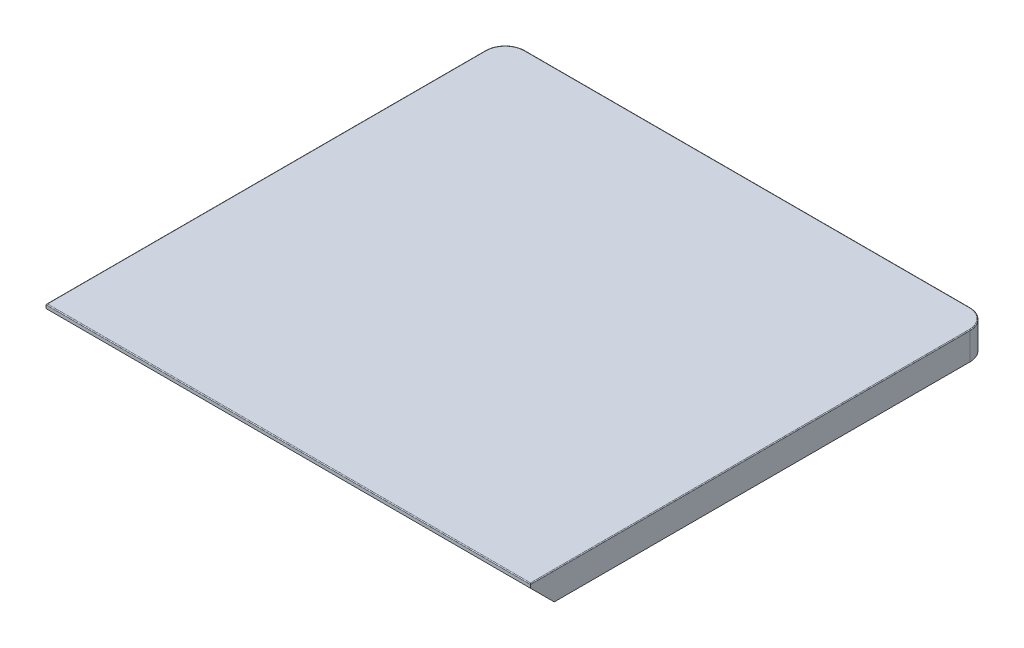
ISO-10303-21;
HEADER;
FILE_DESCRIPTION(('STEP AP214'),'2;1');
FILE_NAME('part.step','',(''),(''),'','','');
FILE_SCHEMA(('AUTOMOTIVE_DESIGN { 1 0 10303 214 1 1 1 1 }'));
ENDSEC;
DATA;
#1=APPLICATION_CONTEXT('core data for automotive mechanical design processes');
#2=APPLICATION_PROTOCOL_DEFINITION('international standard','automotive_design',2000,#1);
#3=PRODUCT_CONTEXT('',#1,'mechanical');
#4=PRODUCT('Part','Part','',(#3));
#5=PRODUCT_RELATED_PRODUCT_CATEGORY('part','',(#4));
#6=PRODUCT_DEFINITION_FORMATION('','',#4);
#7=PRODUCT_DEFINITION_CONTEXT('part definition',#1,'design');
#8=PRODUCT_DEFINITION('design','',#6,#7);
#9=PRODUCT_DEFINITION_SHAPE('','',#8);
#10=(LENGTH_UNIT() NAMED_UNIT(*) SI_UNIT(.MILLI.,.METRE.));
#11=(NAMED_UNIT(*) PLANE_ANGLE_UNIT() SI_UNIT($,.RADIAN.));
#12=(NAMED_UNIT(*) SI_UNIT($,.STERADIAN.) SOLID_ANGLE_UNIT());
#13=UNCERTAINTY_MEASURE_WITH_UNIT(LENGTH_MEASURE(1.E-05),#10,'distance_accuracy_value','');
#14=(GEOMETRIC_REPRESENTATION_CONTEXT(3) GLOBAL_UNCERTAINTY_ASSIGNED_CONTEXT((#13)) GLOBAL_UNIT_ASSIGNED_CONTEXT((#10,
#11,#12)) REPRESENTATION_CONTEXT('',''));
#15=CARTESIAN_POINT('',(0.,0.,0.));
#16=DIRECTION('',(0.,0.,1.));
#17=DIRECTION('',(1.,0.,0.));
#18=AXIS2_PLACEMENT_3D('',#15,#16,#17);
#19=CARTESIAN_POINT('',(0.,-35.,0.));
#20=DIRECTION('',(0.,-1.,0.));
#21=DIRECTION('',(0.,0.,-1.));
#22=AXIS2_PLACEMENT_3D('',#19,#20,#21);
#23=PLANE('',#22);
#24=DIRECTION('',(0.,0.,1.));
#25=VECTOR('',#24,1.);
#26=CARTESIAN_POINT('',(5.42321072285179,-35.,179.503525588153));
#27=LINE('',#26,#25);
#28=CARTESIAN_POINT('',(5.42321072285179,-35.,-175.496474411846));
#29=VERTEX_POINT('',#28);
#30=CARTESIAN_POINT('',(5.42321072285179,-35.,179.503525588153));
#31=VERTEX_POINT('',#30);
#32=EDGE_CURVE('E66',#29,#31,#27,.T.);
#33=ORIENTED_EDGE('',*,*,#32,.F.);
#34=DIRECTION('',(1.,0.,0.));
#35=VECTOR('',#34,1.);
#36=CARTESIAN_POINT('',(19.7759190350162,-35.,-175.496474411846));
#37=LINE('',#36,#35);
#38=CARTESIAN_POINT('',(19.7759190350162,-35.,-175.496474411846));
#39=VERTEX_POINT('',#38);
#40=EDGE_CURVE('E395',#29,#39,#37,.T.);
#41=ORIENTED_EDGE('',*,*,#40,.T.);
#42=DIRECTION('',(0.,0.,1.));
#43=VECTOR('',#42,1.);
#44=CARTESIAN_POINT('',(19.7759190350162,-35.,-225.496474411847));
#45=LINE('',#44,#43);
#46=CARTESIAN_POINT('',(19.7759190350162,-35.,179.503525588153));
#47=VERTEX_POINT('',#46);
#48=EDGE_CURVE('E301',#39,#47,#45,.T.);
#49=ORIENTED_EDGE('',*,*,#48,.T.);
#50=DIRECTION('',(-1.,0.,0.));
#51=VECTOR('',#50,1.);
#52=CARTESIAN_POINT('',(-18.1501687280572,-35.,179.503525588153));
#53=LINE('',#52,#51);
#54=EDGE_CURVE('E392',#47,#31,#53,.T.);
#55=ORIENTED_EDGE('',*,*,#54,.T.);
#56=EDGE_LOOP('',(#33,#41,#49,#55));
#57=FACE_BOUND('',#56,.T.);
#58=ADVANCED_FACE('F42',(#57),#23,.T.);
#59=CARTESIAN_POINT('',(0.,-35.,0.));
#60=DIRECTION('',(0.,-1.,0.));
#61=DIRECTION('',(0.,0.,-1.));
#62=AXIS2_PLACEMENT_3D('',#59,#60,#61);
#63=PLANE('',#62);
#64=DIRECTION('',(0.,0.,1.));
#65=VECTOR('',#64,1.);
#66=CARTESIAN_POINT('',(-375.815236259086,-35.,179.39659219798));
#67=LINE('',#66,#65);
#68=CARTESIAN_POINT('',(-375.815236259086,-35.,-175.09436473107));
#69=VERTEX_POINT('',#68);
#70=CARTESIAN_POINT('',(-375.815236259086,-35.,179.39659219798));
#71=VERTEX_POINT('',#70);
#72=EDGE_CURVE('E58',#69,#71,#67,.T.);
#73=ORIENTED_EDGE('',*,*,#72,.F.);
#74=DIRECTION('',(0.999821655017895,0.,0.0188853953434227));
#75=VECTOR('',#74,1.);
#76=CARTESIAN_POINT('',(-363.236846186385,-35.,-174.856774488736));
#77=LINE('',#76,#75);
#78=CARTESIAN_POINT('',(-362.292576419214,-35.,-174.838938399895));
#79=VERTEX_POINT('',#78);
#80=EDGE_CURVE('E411',#69,#79,#77,.T.);
#81=ORIENTED_EDGE('',*,*,#80,.T.);
#82=DIRECTION('',(0.,0.,1.));
#83=VECTOR('',#82,1.);
#84=CARTESIAN_POINT('',(-362.292576419214,-35.,-224.847857239631));
#85=LINE('',#84,#83);
#86=CARTESIAN_POINT('',(-362.292576419214,-35.,179.39659219798));
#87=VERTEX_POINT('',#86);
#88=EDGE_CURVE('E253',#79,#87,#85,.T.);
#89=ORIENTED_EDGE('',*,*,#88,.T.);
#90=DIRECTION('',(-1.,0.,0.));
#91=VECTOR('',#90,1.);
#92=CARTESIAN_POINT('',(-402.292576419214,-35.,179.39659219798));
#93=LINE('',#92,#91);
#94=EDGE_CURVE('E408',#87,#71,#93,.T.);
#95=ORIENTED_EDGE('',*,*,#94,.T.);
#96=EDGE_LOOP('',(#73,#81,#89,#95));
#97=FACE_BOUND('',#96,.T.);
#98=ADVANCED_FACE('F444',(#97),#63,.T.);
#99=CARTESIAN_POINT('',(0.,0.,0.));
#100=DIRECTION('',(0.,1.,0.));
#101=DIRECTION('',(0.,0.,1.));
#102=AXIS2_PLACEMENT_3D('',#99,#100,#101);
#103=PLANE('',#102);
#104=DIRECTION('',(0.,0.,-1.));
#105=VECTOR('',#104,1.);
#106=CARTESIAN_POINT('',(-18.1501687280572,0.,-225.496474411847));
#107=LINE('',#106,#105);
#108=CARTESIAN_POINT('',(-18.1501687280572,0.,214.503525588153));
#109=VERTEX_POINT('',#108);
#110=CARTESIAN_POINT('',(-18.1501687280572,0.,-210.496474411846));
#111=VERTEX_POINT('',#110);
#112=EDGE_CURVE('E293',#109,#111,#107,.T.);
#113=ORIENTED_EDGE('',*,*,#112,.F.);
#114=DIRECTION('',(1.,0.,0.));
#115=VECTOR('',#114,1.);
#116=CARTESIAN_POINT('',(0.,0.,214.503525588153));
#117=LINE('',#116,#115);
#118=CARTESIAN_POINT('',(19.7759190350162,0.,214.503525588153));
#119=VERTEX_POINT('',#118);
#120=EDGE_CURVE('E11',#109,#119,#117,.T.);
#121=ORIENTED_EDGE('',*,*,#120,.T.);
#122=DIRECTION('',(0.,0.,1.));
#123=VECTOR('',#122,1.);
#124=CARTESIAN_POINT('',(19.7759190350162,0.,-225.496474411847));
#125=LINE('',#124,#123);
#126=CARTESIAN_POINT('',(19.7759190350162,0.,-210.496474411846));
#127=VERTEX_POINT('',#126);
#128=EDGE_CURVE('E302',#127,#119,#125,.T.);
#129=ORIENTED_EDGE('',*,*,#128,.F.);
#130=DIRECTION('',(-1.,0.,0.));
#131=VECTOR('',#130,1.);
#132=CARTESIAN_POINT('',(0.,0.,-210.496474411846));
#133=LINE('',#132,#131);
#134=EDGE_CURVE('E423',#127,#111,#133,.T.);
#135=ORIENTED_EDGE('',*,*,#134,.T.);
#136=EDGE_LOOP('',(#113,#121,#129,#135));
#137=FACE_BOUND('',#136,.T.);
#138=DIRECTION('',(0.,0.,1.));
#139=VECTOR('',#138,1.);
#140=CARTESIAN_POINT('',(-497.292576419214,0.,320.));
#141=LINE('',#140,#139);
#142=CARTESIAN_POINT('',(-497.292576419214,0.,-235.));
#143=VERTEX_POINT('',#142);
#144=CARTESIAN_POINT('',(-497.292576419214,0.,290.));
#145=VERTEX_POINT('',#144);
#146=EDGE_CURVE('E310',#143,#145,#141,.T.);
#147=ORIENTED_EDGE('',*,*,#146,.F.);
#148=CARTESIAN_POINT('',(-472.292576419214,0.,-235.));
#149=DIRECTION('',(0.,1.,0.));
#150=DIRECTION('',(0.,0.,1.));
#151=AXIS2_PLACEMENT_3D('',#148,#149,#150);
#152=CIRCLE('',#151,25.);
#153=CARTESIAN_POINT('',(-472.292576419214,0.,-260.));
#154=VERTEX_POINT('',#153);
#155=EDGE_CURVE('E379',#143,#154,#152,.F.);
#156=ORIENTED_EDGE('',*,*,#155,.T.);
#157=DIRECTION('',(-1.,0.,0.));
#158=VECTOR('',#157,1.);
#159=CARTESIAN_POINT('',(114.707423580786,0.,-260.));
#160=LINE('',#159,#158);
#161=CARTESIAN_POINT('',(89.7074235807858,0.,-260.));
#162=VERTEX_POINT('',#161);
#163=EDGE_CURVE('E316',#162,#154,#160,.T.);
#164=ORIENTED_EDGE('',*,*,#163,.F.);
#165=CARTESIAN_POINT('',(89.7074235807858,0.,-235.));
#166=DIRECTION('',(0.,1.,0.));
#167=DIRECTION('',(0.,0.,1.));
#168=AXIS2_PLACEMENT_3D('',#165,#166,#167);
#169=CIRCLE('',#168,25.);
#170=CARTESIAN_POINT('',(114.707423580786,0.,-235.));
#171=VERTEX_POINT('',#170);
#172=EDGE_CURVE('E377',#162,#171,#169,.F.);
#173=ORIENTED_EDGE('',*,*,#172,.T.);
#174=DIRECTION('',(0.,0.,-1.));
#175=VECTOR('',#174,1.);
#176=CARTESIAN_POINT('',(114.707423580786,0.,320.));
#177=LINE('',#176,#175);
#178=CARTESIAN_POINT('',(114.707423580786,0.,290.));
#179=VERTEX_POINT('',#178);
#180=EDGE_CURVE('E312',#179,#171,#177,.T.);
#181=ORIENTED_EDGE('',*,*,#180,.F.);
#182=DIRECTION('',(-1.,0.,0.));
#183=VECTOR('',#182,1.);
#184=CARTESIAN_POINT('',(0.,0.,290.));
#185=LINE('',#184,#183);
#186=EDGE_CURVE('E356',#179,#145,#185,.T.);
#187=ORIENTED_EDGE('',*,*,#186,.T.);
#188=EDGE_LOOP('',(#147,#156,#164,#173,#181,#187));
#189=FACE_BOUND('',#188,.T.);
#190=DIRECTION('',(0.,0.,-1.));
#191=VECTOR('',#190,1.);
#192=CARTESIAN_POINT('',(-402.292576419214,0.,-225.60340780202));
#193=LINE('',#192,#191);
#194=CARTESIAN_POINT('',(-402.292576419214,0.,214.39659219798));
#195=VERTEX_POINT('',#194);
#196=CARTESIAN_POINT('',(-402.292576419214,0.,-210.600732150099));
#197=VERTEX_POINT('',#196);
#198=EDGE_CURVE('E289',#195,#197,#193,.T.);
#199=ORIENTED_EDGE('',*,*,#198,.F.);
#200=DIRECTION('',(1.,0.,0.));
#201=VECTOR('',#200,1.);
#202=CARTESIAN_POINT('',(0.,0.,214.39659219798));
#203=LINE('',#202,#201);
#204=CARTESIAN_POINT('',(-362.292576419214,0.,214.39659219798));
#205=VERTEX_POINT('',#204);
#206=EDGE_CURVE('E51',#195,#205,#203,.T.);
#207=ORIENTED_EDGE('',*,*,#206,.T.);
#208=DIRECTION('',(0.,0.,1.));
#209=VECTOR('',#208,1.);
#210=CARTESIAN_POINT('',(-362.292576419214,0.,-224.847857239631));
#211=LINE('',#210,#209);
#212=CARTESIAN_POINT('',(-362.292576419214,0.,-209.84518158771));
#213=VERTEX_POINT('',#212);
#214=EDGE_CURVE('E286',#213,#205,#211,.T.);
#215=ORIENTED_EDGE('',*,*,#214,.F.);
#216=DIRECTION('',(-0.999821655017895,0.,-0.0188853953434227));
#217=VECTOR('',#216,1.);
#218=CARTESIAN_POINT('',(3.83308782968772,0.,-202.929520299508));
#219=LINE('',#218,#217);
#220=EDGE_CURVE('E425',#213,#197,#219,.T.);
#221=ORIENTED_EDGE('',*,*,#220,.T.);
#222=EDGE_LOOP('',(#199,#207,#215,#221));
#223=FACE_BOUND('',#222,.T.);
#224=ADVANCED_FACE('F430',(#137,#189,#223),#103,.F.);
#225=CARTESIAN_POINT('',(0.,35.,0.));
#226=DIRECTION('',(0.,1.,0.));
#227=DIRECTION('',(0.,0.,1.));
#228=AXIS2_PLACEMENT_3D('',#225,#226,#227);
#229=PLANE('',#228);
#230=CARTESIAN_POINT('',(89.7074235807858,35.,-235.));
#231=DIRECTION('',(0.,1.,0.));
#232=DIRECTION('',(0.,0.,1.));
#233=AXIS2_PLACEMENT_3D('',#230,#231,#232);
#234=CIRCLE('',#233,24.);
#235=CARTESIAN_POINT('',(89.7074235807858,35.,-259.));
#236=VERTEX_POINT('',#235);
#237=CARTESIAN_POINT('',(113.707423580786,35.,-235.));
#238=VERTEX_POINT('',#237);
#239=EDGE_CURVE('E367',#236,#238,#234,.F.);
#240=ORIENTED_EDGE('',*,*,#239,.F.);
#241=DIRECTION('',(-1.,0.,0.));
#242=VECTOR('',#241,1.);
#243=CARTESIAN_POINT('',(-497.292576419214,35.,-259.));
#244=LINE('',#243,#242);
#245=CARTESIAN_POINT('',(-472.292576419214,35.,-259.));
#246=VERTEX_POINT('',#245);
#247=EDGE_CURVE('E332',#236,#246,#244,.T.);
#248=ORIENTED_EDGE('',*,*,#247,.T.);
#249=CARTESIAN_POINT('',(-472.292576419214,35.,-235.));
#250=DIRECTION('',(0.,1.,0.));
#251=DIRECTION('',(0.,0.,1.));
#252=AXIS2_PLACEMENT_3D('',#249,#250,#251);
#253=CIRCLE('',#252,24.);
#254=CARTESIAN_POINT('',(-496.292576419214,35.,-235.));
#255=VERTEX_POINT('',#254);
#256=EDGE_CURVE('E364',#255,#246,#253,.F.);
#257=ORIENTED_EDGE('',*,*,#256,.F.);
#258=DIRECTION('',(0.,0.,1.));
#259=VECTOR('',#258,1.);
#260=CARTESIAN_POINT('',(-496.292576419214,35.,320.));
#261=LINE('',#260,#259);
#262=CARTESIAN_POINT('',(-496.292576419214,35.,319.));
#263=VERTEX_POINT('',#262);
#264=EDGE_CURVE('E325',#255,#263,#261,.T.);
#265=ORIENTED_EDGE('',*,*,#264,.T.);
#266=DIRECTION('',(1.,0.,0.));
#267=VECTOR('',#266,1.);
#268=CARTESIAN_POINT('',(114.707423580786,35.,319.));
#269=LINE('',#268,#267);
#270=CARTESIAN_POINT('',(113.707423580786,35.,319.));
#271=VERTEX_POINT('',#270);
#272=EDGE_CURVE('E327',#263,#271,#269,.T.);
#273=ORIENTED_EDGE('',*,*,#272,.T.);
#274=DIRECTION('',(0.,0.,-1.));
#275=VECTOR('',#274,1.);
#276=CARTESIAN_POINT('',(113.707423580786,35.,-260.));
#277=LINE('',#276,#275);
#278=EDGE_CURVE('E329',#271,#238,#277,.T.);
#279=ORIENTED_EDGE('',*,*,#278,.T.);
#280=EDGE_LOOP('',(#240,#248,#257,#265,#273,#279));
#281=FACE_BOUND('',#280,.T.);
#282=ADVANCED_FACE('F522',(#281),#229,.T.);
#283=CARTESIAN_POINT('',(-497.292576419214,35.,320.));
#284=DIRECTION('',(1.,0.,0.));
#285=DIRECTION('',(0.,0.,-1.));
#286=AXIS2_PLACEMENT_3D('',#283,#284,#285);
#287=PLANE('',#286);
#288=DIRECTION('',(0.,0.,1.));
#289=VECTOR('',#288,1.);
#290=CARTESIAN_POINT('',(-497.292576419214,34.,-260.));
#291=LINE('',#290,#289);
#292=CARTESIAN_POINT('',(-497.292576419214,34.,320.));
#293=VERTEX_POINT('',#292);
#294=CARTESIAN_POINT('',(-497.292576419214,34.,-235.));
#295=VERTEX_POINT('',#294);
#296=EDGE_CURVE('E342',#293,#295,#291,.F.);
#297=ORIENTED_EDGE('',*,*,#296,.T.);
#298=DIRECTION('',(0.,-1.,0.));
#299=VECTOR('',#298,1.);
#300=CARTESIAN_POINT('',(-497.292576419214,35.,-235.));
#301=LINE('',#300,#299);
#302=EDGE_CURVE('E375',#295,#143,#301,.T.);
#303=ORIENTED_EDGE('',*,*,#302,.T.);
#304=ORIENTED_EDGE('',*,*,#146,.T.);
#305=DIRECTION('',(0.,-0.707106781186548,-0.707106781186548));
#306=VECTOR('',#305,1.);
#307=CARTESIAN_POINT('',(-497.292576419214,30.,320.));
#308=LINE('',#307,#306);
#309=CARTESIAN_POINT('',(-497.292576419214,30.,320.));
#310=VERTEX_POINT('',#309);
#311=EDGE_CURVE('E359',#145,#310,#308,.F.);
#312=ORIENTED_EDGE('',*,*,#311,.T.);
#313=DIRECTION('',(0.,-1.,0.));
#314=VECTOR('',#313,1.);
#315=CARTESIAN_POINT('',(-497.292576419214,35.,320.));
#316=LINE('',#315,#314);
#317=EDGE_CURVE('E322',#293,#310,#316,.T.);
#318=ORIENTED_EDGE('',*,*,#317,.F.);
#319=EDGE_LOOP('',(#297,#303,#304,#312,#318));
#320=FACE_BOUND('',#319,.T.);
#321=ADVANCED_FACE('F565',(#320),#287,.F.);
#322=CARTESIAN_POINT('',(114.707423580786,35.,320.));
#323=DIRECTION('',(0.,0.,-1.));
#324=DIRECTION('',(-1.,0.,0.));
#325=AXIS2_PLACEMENT_3D('',#322,#323,#324);
#326=PLANE('',#325);
#327=ORIENTED_EDGE('',*,*,#317,.T.);
#328=DIRECTION('',(1.,0.,0.));
#329=VECTOR('',#328,1.);
#330=CARTESIAN_POINT('',(114.707423580786,30.,320.));
#331=LINE('',#330,#329);
#332=CARTESIAN_POINT('',(114.707423580786,30.,320.));
#333=VERTEX_POINT('',#332);
#334=EDGE_CURVE('E345',#310,#333,#331,.T.);
#335=ORIENTED_EDGE('',*,*,#334,.T.);
#336=DIRECTION('',(0.,-1.,0.));
#337=VECTOR('',#336,1.);
#338=CARTESIAN_POINT('',(114.707423580786,35.,320.));
#339=LINE('',#338,#337);
#340=CARTESIAN_POINT('',(114.707423580786,34.,320.));
#341=VERTEX_POINT('',#340);
#342=EDGE_CURVE('E319',#341,#333,#339,.T.);
#343=ORIENTED_EDGE('',*,*,#342,.F.);
#344=DIRECTION('',(1.,0.,0.));
#345=VECTOR('',#344,1.);
#346=CARTESIAN_POINT('',(-497.292576419214,34.,320.));
#347=LINE('',#346,#345);
#348=EDGE_CURVE('E340',#341,#293,#347,.F.);
#349=ORIENTED_EDGE('',*,*,#348,.T.);
#350=EDGE_LOOP('',(#327,#335,#343,#349));
#351=FACE_BOUND('',#350,.T.);
#352=ADVANCED_FACE('F561',(#351),#326,.F.);
#353=CARTESIAN_POINT('',(114.707423580786,35.,320.));
#354=DIRECTION('',(-1.,0.,0.));
#355=DIRECTION('',(0.,0.,1.));
#356=AXIS2_PLACEMENT_3D('',#353,#354,#355);
#357=PLANE('',#356);
#358=ORIENTED_EDGE('',*,*,#180,.T.);
#359=DIRECTION('',(0.,-1.,0.));
#360=VECTOR('',#359,1.);
#361=CARTESIAN_POINT('',(114.707423580786,35.,-235.));
#362=LINE('',#361,#360);
#363=CARTESIAN_POINT('',(114.707423580786,34.,-235.));
#364=VERTEX_POINT('',#363);
#365=EDGE_CURVE('E385',#171,#364,#362,.F.);
#366=ORIENTED_EDGE('',*,*,#365,.T.);
#367=DIRECTION('',(0.,0.,-1.));
#368=VECTOR('',#367,1.);
#369=CARTESIAN_POINT('',(114.707423580786,34.,320.));
#370=LINE('',#369,#368);
#371=EDGE_CURVE('E338',#364,#341,#370,.F.);
#372=ORIENTED_EDGE('',*,*,#371,.T.);
#373=ORIENTED_EDGE('',*,*,#342,.T.);
#374=DIRECTION('',(0.,0.707106781186548,0.707106781186548));
#375=VECTOR('',#374,1.);
#376=CARTESIAN_POINT('',(114.707423580786,30.,320.));
#377=LINE('',#376,#375);
#378=EDGE_CURVE('E354',#333,#179,#377,.F.);
#379=ORIENTED_EDGE('',*,*,#378,.T.);
#380=EDGE_LOOP('',(#358,#366,#372,#373,#379));
#381=FACE_BOUND('',#380,.T.);
#382=ADVANCED_FACE('F554',(#381),#357,.F.);
#383=CARTESIAN_POINT('',(114.707423580786,35.,-260.));
#384=DIRECTION('',(0.,0.,1.));
#385=DIRECTION('',(1.,0.,0.));
#386=AXIS2_PLACEMENT_3D('',#383,#384,#385);
#387=PLANE('',#386);
#388=ORIENTED_EDGE('',*,*,#163,.T.);
#389=DIRECTION('',(0.,-1.,0.));
#390=VECTOR('',#389,1.);
#391=CARTESIAN_POINT('',(-472.292576419214,35.,-260.));
#392=LINE('',#391,#390);
#393=CARTESIAN_POINT('',(-472.292576419214,34.,-260.));
#394=VERTEX_POINT('',#393);
#395=EDGE_CURVE('E383',#154,#394,#392,.F.);
#396=ORIENTED_EDGE('',*,*,#395,.T.);
#397=DIRECTION('',(-1.,0.,0.));
#398=VECTOR('',#397,1.);
#399=CARTESIAN_POINT('',(114.707423580786,34.,-260.));
#400=LINE('',#399,#398);
#401=CARTESIAN_POINT('',(89.7074235807858,34.,-260.));
#402=VERTEX_POINT('',#401);
#403=EDGE_CURVE('E335',#394,#402,#400,.F.);
#404=ORIENTED_EDGE('',*,*,#403,.T.);
#405=DIRECTION('',(0.,-1.,0.));
#406=VECTOR('',#405,1.);
#407=CARTESIAN_POINT('',(89.7074235807858,35.,-260.));
#408=LINE('',#407,#406);
#409=EDGE_CURVE('E381',#402,#162,#408,.T.);
#410=ORIENTED_EDGE('',*,*,#409,.T.);
#411=EDGE_LOOP('',(#388,#396,#404,#410));
#412=FACE_BOUND('',#411,.T.);
#413=ADVANCED_FACE('F539',(#412),#387,.F.);
#414=CARTESIAN_POINT('',(0.,34.,319.));
#415=DIRECTION('',(-1.,0.,0.));
#416=DIRECTION('',(0.,0.,1.));
#417=AXIS2_PLACEMENT_3D('',#414,#415,#416);
#418=CYLINDRICAL_SURFACE('',#417,1.);
#419=CARTESIAN_POINT('',(-496.292576419214,34.,319.));
#420=DIRECTION('',(-0.707106781186547,0.,-0.707106781186547));
#421=DIRECTION('',(0.707106781186547,0.,-0.707106781186547));
#422=AXIS2_PLACEMENT_3D('',#419,#420,#421);
#423=ELLIPSE('',#422,1.41421356237309,1.);
#424=EDGE_CURVE('E346',#293,#263,#423,.T.);
#425=ORIENTED_EDGE('',*,*,#424,.F.);
#426=ORIENTED_EDGE('',*,*,#348,.F.);
#427=CARTESIAN_POINT('',(113.707423580786,34.,319.));
#428=DIRECTION('',(-0.707106781186547,0.,0.707106781186547));
#429=DIRECTION('',(-0.707106781186547,0.,-0.707106781186547));
#430=AXIS2_PLACEMENT_3D('',#427,#428,#429);
#431=ELLIPSE('',#430,1.41421356237309,1.);
#432=EDGE_CURVE('E313',#271,#341,#431,.F.);
#433=ORIENTED_EDGE('',*,*,#432,.F.);
#434=ORIENTED_EDGE('',*,*,#272,.F.);
#435=EDGE_LOOP('',(#425,#426,#433,#434));
#436=FACE_BOUND('',#435,.T.);
#437=ADVANCED_FACE('F569',(#436),#418,.T.);
#438=CARTESIAN_POINT('',(113.707423580786,34.,0.));
#439=DIRECTION('',(0.,0.,1.));
#440=DIRECTION('',(1.,0.,0.));
#441=AXIS2_PLACEMENT_3D('',#438,#439,#440);
#442=CYLINDRICAL_SURFACE('',#441,1.);
#443=ORIENTED_EDGE('',*,*,#371,.F.);
#444=CARTESIAN_POINT('',(113.707423580786,34.,-235.));
#445=DIRECTION('',(0.,0.,1.));
#446=DIRECTION('',(1.,0.,0.));
#447=AXIS2_PLACEMENT_3D('',#444,#445,#446);
#448=CIRCLE('',#447,1.);
#449=EDGE_CURVE('E361',#364,#238,#448,.T.);
#450=ORIENTED_EDGE('',*,*,#449,.T.);
#451=ORIENTED_EDGE('',*,*,#278,.F.);
#452=ORIENTED_EDGE('',*,*,#432,.T.);
#453=EDGE_LOOP('',(#443,#450,#451,#452));
#454=FACE_BOUND('',#453,.T.);
#455=ADVANCED_FACE('F580',(#454),#442,.T.);
#456=CARTESIAN_POINT('',(-496.292576419214,34.,0.));
#457=DIRECTION('',(0.,0.,-1.));
#458=DIRECTION('',(-1.,0.,0.));
#459=AXIS2_PLACEMENT_3D('',#456,#457,#458);
#460=CYLINDRICAL_SURFACE('',#459,1.);
#461=ORIENTED_EDGE('',*,*,#264,.F.);
#462=CARTESIAN_POINT('',(-496.292576419214,34.,-235.));
#463=DIRECTION('',(0.,0.,1.));
#464=DIRECTION('',(1.,0.,0.));
#465=AXIS2_PLACEMENT_3D('',#462,#463,#464);
#466=CIRCLE('',#465,1.);
#467=EDGE_CURVE('E373',#255,#295,#466,.T.);
#468=ORIENTED_EDGE('',*,*,#467,.T.);
#469=ORIENTED_EDGE('',*,*,#296,.F.);
#470=ORIENTED_EDGE('',*,*,#424,.T.);
#471=EDGE_LOOP('',(#461,#468,#469,#470));
#472=FACE_BOUND('',#471,.T.);
#473=ADVANCED_FACE('F573',(#472),#460,.T.);
#474=CARTESIAN_POINT('',(0.,34.,-259.));
#475=DIRECTION('',(1.,0.,0.));
#476=DIRECTION('',(0.,0.,-1.));
#477=AXIS2_PLACEMENT_3D('',#474,#475,#476);
#478=CYLINDRICAL_SURFACE('',#477,1.);
#479=ORIENTED_EDGE('',*,*,#403,.F.);
#480=CARTESIAN_POINT('',(-472.292576419214,34.,-259.));
#481=DIRECTION('',(1.,0.,0.));
#482=DIRECTION('',(0.,0.,-1.));
#483=AXIS2_PLACEMENT_3D('',#480,#481,#482);
#484=CIRCLE('',#483,1.);
#485=EDGE_CURVE('E371',#394,#246,#484,.T.);
#486=ORIENTED_EDGE('',*,*,#485,.T.);
#487=ORIENTED_EDGE('',*,*,#247,.F.);
#488=CARTESIAN_POINT('',(89.7074235807858,34.,-259.));
#489=DIRECTION('',(-1.,0.,0.));
#490=DIRECTION('',(0.,0.,1.));
#491=AXIS2_PLACEMENT_3D('',#488,#489,#490);
#492=CIRCLE('',#491,1.);
#493=EDGE_CURVE('E369',#236,#402,#492,.T.);
#494=ORIENTED_EDGE('',*,*,#493,.T.);
#495=EDGE_LOOP('',(#479,#486,#487,#494));
#496=FACE_BOUND('',#495,.T.);
#497=ADVANCED_FACE('F542',(#496),#478,.T.);
#498=CARTESIAN_POINT('',(114.707423580786,30.,320.));
#499=DIRECTION('',(0.,0.707106781186548,-0.707106781186548));
#500=DIRECTION('',(1.,0.,0.));
#501=AXIS2_PLACEMENT_3D('',#498,#499,#500);
#502=PLANE('',#501);
#503=ORIENTED_EDGE('',*,*,#311,.F.);
#504=ORIENTED_EDGE('',*,*,#186,.F.);
#505=ORIENTED_EDGE('',*,*,#378,.F.);
#506=ORIENTED_EDGE('',*,*,#334,.F.);
#507=EDGE_LOOP('',(#503,#504,#505,#506));
#508=FACE_BOUND('',#507,.T.);
#509=ADVANCED_FACE('F559',(#508),#502,.F.);
#510=CARTESIAN_POINT('',(89.7074235807858,35.,-235.));
#511=DIRECTION('',(0.,-1.,0.));
#512=DIRECTION('',(0.,0.,-1.));
#513=AXIS2_PLACEMENT_3D('',#510,#511,#512);
#514=CYLINDRICAL_SURFACE('',#513,25.);
#515=ORIENTED_EDGE('',*,*,#172,.F.);
#516=ORIENTED_EDGE('',*,*,#409,.F.);
#517=CARTESIAN_POINT('',(89.7074235807858,34.,-235.));
#518=DIRECTION('',(0.,1.,0.));
#519=DIRECTION('',(0.,0.,1.));
#520=AXIS2_PLACEMENT_3D('',#517,#518,#519);
#521=CIRCLE('',#520,25.);
#522=EDGE_CURVE('E349',#364,#402,#521,.T.);
#523=ORIENTED_EDGE('',*,*,#522,.F.);
#524=ORIENTED_EDGE('',*,*,#365,.F.);
#525=EDGE_LOOP('',(#515,#516,#523,#524));
#526=FACE_BOUND('',#525,.T.);
#527=ADVANCED_FACE('F552',(#526),#514,.T.);
#528=CARTESIAN_POINT('',(89.7074235807858,34.,-235.));
#529=DIRECTION('',(0.,1.,0.));
#530=DIRECTION('',(0.,0.,1.));
#531=AXIS2_PLACEMENT_3D('',#528,#529,#530);
#532=TOROIDAL_SURFACE('',#531,24.,1.);
#533=ORIENTED_EDGE('',*,*,#449,.F.);
#534=ORIENTED_EDGE('',*,*,#522,.T.);
#535=ORIENTED_EDGE('',*,*,#493,.F.);
#536=ORIENTED_EDGE('',*,*,#239,.T.);
#537=EDGE_LOOP('',(#533,#534,#535,#536));
#538=FACE_BOUND('',#537,.T.);
#539=ADVANCED_FACE('F547',(#538),#532,.T.);
#540=CARTESIAN_POINT('',(-472.292576419214,35.,-235.));
#541=DIRECTION('',(0.,-1.,0.));
#542=DIRECTION('',(0.,0.,-1.));
#543=AXIS2_PLACEMENT_3D('',#540,#541,#542);
#544=CYLINDRICAL_SURFACE('',#543,25.);
#545=ORIENTED_EDGE('',*,*,#155,.F.);
#546=ORIENTED_EDGE('',*,*,#302,.F.);
#547=CARTESIAN_POINT('',(-472.292576419214,34.,-235.));
#548=DIRECTION('',(0.,1.,0.));
#549=DIRECTION('',(0.,0.,1.));
#550=AXIS2_PLACEMENT_3D('',#547,#548,#549);
#551=CIRCLE('',#550,25.);
#552=EDGE_CURVE('E305',#394,#295,#551,.T.);
#553=ORIENTED_EDGE('',*,*,#552,.F.);
#554=ORIENTED_EDGE('',*,*,#395,.F.);
#555=EDGE_LOOP('',(#545,#546,#553,#554));
#556=FACE_BOUND('',#555,.T.);
#557=ADVANCED_FACE('F534',(#556),#544,.T.);
#558=CARTESIAN_POINT('',(-472.292576419214,34.,-235.));
#559=DIRECTION('',(0.,1.,0.));
#560=DIRECTION('',(0.,0.,1.));
#561=AXIS2_PLACEMENT_3D('',#558,#559,#560);
#562=TOROIDAL_SURFACE('',#561,24.,1.);
#563=ORIENTED_EDGE('',*,*,#467,.F.);
#564=ORIENTED_EDGE('',*,*,#256,.T.);
#565=ORIENTED_EDGE('',*,*,#485,.F.);
#566=ORIENTED_EDGE('',*,*,#552,.T.);
#567=EDGE_LOOP('',(#563,#564,#565,#566));
#568=FACE_BOUND('',#567,.T.);
#569=ADVANCED_FACE('F576',(#568),#562,.T.);
#570=CARTESIAN_POINT('',(-18.1501687280572,-35.,-225.496474411847));
#571=DIRECTION('',(1.,0.,0.));
#572=DIRECTION('',(0.,0.,-1.));
#573=AXIS2_PLACEMENT_3D('',#570,#571,#572);
#574=PLANE('',#573);
#575=ORIENTED_EDGE('',*,*,#112,.T.);
#576=DIRECTION('',(0.,-0.707106781186548,0.707106781186548));
#577=VECTOR('',#576,1.);
#578=CARTESIAN_POINT('',(-18.1501687280572,-35.,-175.496474411846));
#579=LINE('',#578,#577);
#580=CARTESIAN_POINT('',(-18.1501687280572,-35.,-175.496474411846));
#581=VERTEX_POINT('',#580);
#582=EDGE_CURVE('E405',#111,#581,#579,.T.);
#583=ORIENTED_EDGE('',*,*,#582,.T.);
#584=DIRECTION('',(0.,0.,-1.));
#585=VECTOR('',#584,1.);
#586=CARTESIAN_POINT('',(-18.1501687280572,-35.,-225.496474411847));
#587=LINE('',#586,#585);
#588=CARTESIAN_POINT('',(-18.1501687280572,-35.,179.503525588153));
#589=VERTEX_POINT('',#588);
#590=EDGE_CURVE('E298',#589,#581,#587,.T.);
#591=ORIENTED_EDGE('',*,*,#590,.F.);
#592=DIRECTION('',(0.,0.707106781186548,0.707106781186548));
#593=VECTOR('',#592,1.);
#594=CARTESIAN_POINT('',(-18.1501687280572,-35.,179.503525588153));
#595=LINE('',#594,#593);
#596=EDGE_CURVE('E403',#589,#109,#595,.T.);
#597=ORIENTED_EDGE('',*,*,#596,.T.);
#598=EDGE_LOOP('',(#575,#583,#591,#597));
#599=FACE_BOUND('',#598,.T.);
#600=ADVANCED_FACE('F496',(#599),#574,.F.);
#601=CARTESIAN_POINT('',(19.7759190350162,-35.,-225.496474411847));
#602=DIRECTION('',(-1.,0.,0.));
#603=DIRECTION('',(0.,0.,1.));
#604=AXIS2_PLACEMENT_3D('',#601,#602,#603);
#605=PLANE('',#604);
#606=ORIENTED_EDGE('',*,*,#48,.F.);
#607=DIRECTION('',(0.,0.707106781186548,-0.707106781186548));
#608=VECTOR('',#607,1.);
#609=CARTESIAN_POINT('',(19.7759190350162,-35.,-175.496474411846));
#610=LINE('',#609,#608);
#611=EDGE_CURVE('E401',#39,#127,#610,.T.);
#612=ORIENTED_EDGE('',*,*,#611,.T.);
#613=ORIENTED_EDGE('',*,*,#128,.T.);
#614=DIRECTION('',(0.,-0.707106781186548,-0.707106781186548));
#615=VECTOR('',#614,1.);
#616=CARTESIAN_POINT('',(19.7759190350162,-35.,179.503525588153));
#617=LINE('',#616,#615);
#618=EDGE_CURVE('E399',#119,#47,#617,.T.);
#619=ORIENTED_EDGE('',*,*,#618,.T.);
#620=EDGE_LOOP('',(#606,#612,#613,#619));
#621=FACE_BOUND('',#620,.T.);
#622=ADVANCED_FACE('F489',(#621),#605,.F.);
#623=DIRECTION('',(0.,0.,-1.));
#624=VECTOR('',#623,1.);
#625=CARTESIAN_POINT('',(-6.76991657934245,-35.,179.503525588153));
#626=LINE('',#625,#624);
#627=CARTESIAN_POINT('',(-6.76991657934245,-35.,179.503525588153));
#628=VERTEX_POINT('',#627);
#629=CARTESIAN_POINT('',(-6.76991657934245,-35.,-175.496474411846));
#630=VERTEX_POINT('',#629);
#631=EDGE_CURVE('E246',#628,#630,#626,.T.);
#632=ORIENTED_EDGE('',*,*,#631,.F.);
#633=EDGE_CURVE('E387',#628,#589,#53,.T.);
#634=ORIENTED_EDGE('',*,*,#633,.T.);
#635=ORIENTED_EDGE('',*,*,#590,.T.);
#636=EDGE_CURVE('E396',#581,#630,#37,.T.);
#637=ORIENTED_EDGE('',*,*,#636,.T.);
#638=EDGE_LOOP('',(#632,#634,#635,#637));
#639=FACE_BOUND('',#638,.T.);
#640=ADVANCED_FACE('F482',(#639),#23,.T.);
#641=CARTESIAN_POINT('',(-402.292576419214,-35.,-225.60340780202));
#642=DIRECTION('',(1.,0.,0.));
#643=DIRECTION('',(0.,0.,-1.));
#644=AXIS2_PLACEMENT_3D('',#641,#642,#643);
#645=PLANE('',#644);
#646=ORIENTED_EDGE('',*,*,#198,.T.);
#647=DIRECTION('',(0.,-0.70704371827859,0.707169838470778));
#648=VECTOR('',#647,1.);
#649=CARTESIAN_POINT('',(-402.292576419214,-38.8293632332901,-171.764442659454));
#650=LINE('',#649,#648);
#651=CARTESIAN_POINT('',(-402.292576419214,-35.,-175.594488962284));
#652=VERTEX_POINT('',#651);
#653=EDGE_CURVE('E421',#197,#652,#650,.T.);
#654=ORIENTED_EDGE('',*,*,#653,.T.);
#655=DIRECTION('',(0.,0.,-1.));
#656=VECTOR('',#655,1.);
#657=CARTESIAN_POINT('',(-402.292576419214,-35.,-225.60340780202));
#658=LINE('',#657,#656);
#659=CARTESIAN_POINT('',(-402.292576419214,-35.,179.39659219798));
#660=VERTEX_POINT('',#659);
#661=EDGE_CURVE('E290',#660,#652,#658,.T.);
#662=ORIENTED_EDGE('',*,*,#661,.F.);
#663=DIRECTION('',(0.,0.707106781186548,0.707106781186548));
#664=VECTOR('',#663,1.);
#665=CARTESIAN_POINT('',(-402.292576419214,-35.,179.39659219798));
#666=LINE('',#665,#664);
#667=EDGE_CURVE('E419',#660,#195,#666,.T.);
#668=ORIENTED_EDGE('',*,*,#667,.T.);
#669=EDGE_LOOP('',(#646,#654,#662,#668));
#670=FACE_BOUND('',#669,.T.);
#671=ADVANCED_FACE('F452',(#670),#645,.F.);
#672=CARTESIAN_POINT('',(-362.292576419214,-35.,-224.847857239631));
#673=DIRECTION('',(-1.,0.,0.));
#674=DIRECTION('',(0.,0.,1.));
#675=AXIS2_PLACEMENT_3D('',#672,#673,#674);
#676=PLANE('',#675);
#677=ORIENTED_EDGE('',*,*,#88,.F.);
#678=DIRECTION('',(0.,0.70704371827859,-0.707169838470778));
#679=VECTOR('',#678,1.);
#680=CARTESIAN_POINT('',(-362.292576419214,-38.4515879581049,-171.386734758594));
#681=LINE('',#680,#679);
#682=EDGE_CURVE('E417',#79,#213,#681,.T.);
#683=ORIENTED_EDGE('',*,*,#682,.T.);
#684=ORIENTED_EDGE('',*,*,#214,.T.);
#685=DIRECTION('',(0.,-0.707106781186548,-0.707106781186548));
#686=VECTOR('',#685,1.);
#687=CARTESIAN_POINT('',(-362.292576419214,-35.,179.39659219798));
#688=LINE('',#687,#686);
#689=EDGE_CURVE('E415',#205,#87,#688,.T.);
#690=ORIENTED_EDGE('',*,*,#689,.T.);
#691=EDGE_LOOP('',(#677,#683,#684,#690));
#692=FACE_BOUND('',#691,.T.);
#693=ADVANCED_FACE('F437',(#692),#676,.F.);
#694=DIRECTION('',(0.,0.,-1.));
#695=VECTOR('',#694,1.);
#696=CARTESIAN_POINT('',(-390.446989021719,-35.,179.39659219798));
#697=LINE('',#696,#695);
#698=CARTESIAN_POINT('',(-390.446989021719,-35.,179.39659219798));
#699=VERTEX_POINT('',#698);
#700=CARTESIAN_POINT('',(-390.446989021719,-35.,-175.370740456784));
#701=VERTEX_POINT('',#700);
#702=EDGE_CURVE('E271',#699,#701,#697,.T.);
#703=ORIENTED_EDGE('',*,*,#702,.F.);
#704=EDGE_CURVE('E407',#699,#660,#93,.T.);
#705=ORIENTED_EDGE('',*,*,#704,.T.);
#706=ORIENTED_EDGE('',*,*,#661,.T.);
#707=EDGE_CURVE('E412',#652,#701,#77,.T.);
#708=ORIENTED_EDGE('',*,*,#707,.T.);
#709=EDGE_LOOP('',(#703,#705,#706,#708));
#710=FACE_BOUND('',#709,.T.);
#711=ADVANCED_FACE('F456',(#710),#63,.T.);
#712=CARTESIAN_POINT('',(0.,-35.,-175.496474411846));
#713=DIRECTION('',(0.,-0.707106781186548,-0.707106781186548));
#714=DIRECTION('',(-1.,0.,0.));
#715=AXIS2_PLACEMENT_3D('',#712,#713,#714);
#716=PLANE('',#715);
#717=ORIENTED_EDGE('',*,*,#582,.F.);
#718=ORIENTED_EDGE('',*,*,#134,.F.);
#719=ORIENTED_EDGE('',*,*,#611,.F.);
#720=ORIENTED_EDGE('',*,*,#40,.F.);
#721=DIRECTION('',(1.,0.,0.));
#722=VECTOR('',#721,1.);
#723=CARTESIAN_POINT('',(-6.76991657934245,-35.,-175.496474411846));
#724=LINE('',#723,#722);
#725=EDGE_CURVE('E240',#630,#29,#724,.T.);
#726=ORIENTED_EDGE('',*,*,#725,.F.);
#727=ORIENTED_EDGE('',*,*,#636,.F.);
#728=EDGE_LOOP('',(#717,#718,#719,#720,#726,#727));
#729=FACE_BOUND('',#728,.T.);
#730=ADVANCED_FACE('F511',(#729),#716,.T.);
#731=CARTESIAN_POINT('',(3.17209899266792,-35.,-167.935762373882));
#732=DIRECTION('',(0.013353991112723,-0.707106781186548,-0.70698067224031));
#733=DIRECTION('',(-0.999821655017895,0.,-0.0188853953434227));
#734=AXIS2_PLACEMENT_3D('',#731,#732,#733);
#735=PLANE('',#734);
#736=ORIENTED_EDGE('',*,*,#653,.F.);
#737=ORIENTED_EDGE('',*,*,#220,.F.);
#738=ORIENTED_EDGE('',*,*,#682,.F.);
#739=ORIENTED_EDGE('',*,*,#80,.F.);
#740=DIRECTION('',(0.999821655017895,0.,0.0188853953434228));
#741=VECTOR('',#740,1.);
#742=CARTESIAN_POINT('',(-390.446989021719,-35.,-175.370740456784));
#743=LINE('',#742,#741);
#744=EDGE_CURVE('E267',#701,#69,#743,.T.);
#745=ORIENTED_EDGE('',*,*,#744,.F.);
#746=ORIENTED_EDGE('',*,*,#707,.F.);
#747=EDGE_LOOP('',(#736,#737,#738,#739,#745,#746));
#748=FACE_BOUND('',#747,.T.);
#749=ADVANCED_FACE('F449',(#748),#735,.T.);
#750=CARTESIAN_POINT('',(0.,-35.,179.39659219798));
#751=DIRECTION('',(0.,-0.707106781186548,0.707106781186548));
#752=DIRECTION('',(1.,0.,0.));
#753=AXIS2_PLACEMENT_3D('',#750,#751,#752);
#754=PLANE('',#753);
#755=ORIENTED_EDGE('',*,*,#689,.F.);
#756=ORIENTED_EDGE('',*,*,#206,.F.);
#757=ORIENTED_EDGE('',*,*,#667,.F.);
#758=ORIENTED_EDGE('',*,*,#704,.F.);
#759=DIRECTION('',(-1.,0.,0.));
#760=VECTOR('',#759,1.);
#761=CARTESIAN_POINT('',(-390.446989021719,-35.,179.39659219798));
#762=LINE('',#761,#760);
#763=EDGE_CURVE('E247',#71,#699,#762,.T.);
#764=ORIENTED_EDGE('',*,*,#763,.F.);
#765=ORIENTED_EDGE('',*,*,#94,.F.);
#766=EDGE_LOOP('',(#755,#756,#757,#758,#764,#765));
#767=FACE_BOUND('',#766,.T.);
#768=ADVANCED_FACE('F440',(#767),#754,.T.);
#769=CARTESIAN_POINT('',(0.,-35.,179.503525588153));
#770=DIRECTION('',(0.,-0.707106781186548,0.707106781186548));
#771=DIRECTION('',(1.,0.,0.));
#772=AXIS2_PLACEMENT_3D('',#769,#770,#771);
#773=PLANE('',#772);
#774=ORIENTED_EDGE('',*,*,#618,.F.);
#775=ORIENTED_EDGE('',*,*,#120,.F.);
#776=ORIENTED_EDGE('',*,*,#596,.F.);
#777=ORIENTED_EDGE('',*,*,#633,.F.);
#778=DIRECTION('',(-1.,0.,0.));
#779=VECTOR('',#778,1.);
#780=CARTESIAN_POINT('',(-6.76991657934245,-35.,179.503525588153));
#781=LINE('',#780,#779);
#782=EDGE_CURVE('E222',#31,#628,#781,.T.);
#783=ORIENTED_EDGE('',*,*,#782,.F.);
#784=ORIENTED_EDGE('',*,*,#54,.F.);
#785=EDGE_LOOP('',(#774,#775,#776,#777,#783,#784));
#786=FACE_BOUND('',#785,.T.);
#787=ADVANCED_FACE('F45',(#786),#773,.T.);
#788=CARTESIAN_POINT('',(-6.76991657934245,-15.,179.503525588153));
#789=DIRECTION('',(0.,0.,1.));
#790=DIRECTION('',(1.,0.,0.));
#791=AXIS2_PLACEMENT_3D('',#788,#789,#790);
#792=PLANE('',#791);
#793=ORIENTED_EDGE('',*,*,#782,.T.);
#794=DIRECTION('',(0.,-1.,0.));
#795=VECTOR('',#794,1.);
#796=CARTESIAN_POINT('',(-6.76991657934245,-15.,179.503525588153));
#797=LINE('',#796,#795);
#798=CARTESIAN_POINT('',(-6.76991657934245,-15.,179.503525588153));
#799=VERTEX_POINT('',#798);
#800=EDGE_CURVE('E215',#799,#628,#797,.T.);
#801=ORIENTED_EDGE('',*,*,#800,.F.);
#802=DIRECTION('',(-1.,0.,0.));
#803=VECTOR('',#802,1.);
#804=CARTESIAN_POINT('',(-6.76991657934245,-15.,179.503525588153));
#805=LINE('',#804,#803);
#806=CARTESIAN_POINT('',(5.42321072285179,-15.,179.503525588153));
#807=VERTEX_POINT('',#806);
#808=EDGE_CURVE('E219',#807,#799,#805,.T.);
#809=ORIENTED_EDGE('',*,*,#808,.F.);
#810=DIRECTION('',(0.,-1.,0.));
#811=VECTOR('',#810,1.);
#812=CARTESIAN_POINT('',(5.42321072285179,-15.,179.503525588153));
#813=LINE('',#812,#811);
#814=EDGE_CURVE('E251',#807,#31,#813,.T.);
#815=ORIENTED_EDGE('',*,*,#814,.T.);
#816=EDGE_LOOP('',(#793,#801,#809,#815));
#817=FACE_BOUND('',#816,.T.);
#818=ADVANCED_FACE('F217',(#817),#792,.F.);
#819=CARTESIAN_POINT('',(5.42321072285179,-15.,179.503525588153));
#820=DIRECTION('',(1.,0.,0.));
#821=DIRECTION('',(0.,0.,-1.));
#822=AXIS2_PLACEMENT_3D('',#819,#820,#821);
#823=PLANE('',#822);
#824=ORIENTED_EDGE('',*,*,#32,.T.);
#825=ORIENTED_EDGE('',*,*,#814,.F.);
#826=DIRECTION('',(0.,0.,1.));
#827=VECTOR('',#826,1.);
#828=CARTESIAN_POINT('',(5.42321072285179,-15.,179.503525588153));
#829=LINE('',#828,#827);
#830=CARTESIAN_POINT('',(5.42321072285179,-15.,-175.496474411846));
#831=VERTEX_POINT('',#830);
#832=EDGE_CURVE('E227',#831,#807,#829,.T.);
#833=ORIENTED_EDGE('',*,*,#832,.F.);
#834=DIRECTION('',(0.,-1.,0.));
#835=VECTOR('',#834,1.);
#836=CARTESIAN_POINT('',(5.42321072285179,-15.,-175.496474411846));
#837=LINE('',#836,#835);
#838=EDGE_CURVE('E254',#831,#29,#837,.T.);
#839=ORIENTED_EDGE('',*,*,#838,.T.);
#840=EDGE_LOOP('',(#824,#825,#833,#839));
#841=FACE_BOUND('',#840,.T.);
#842=ADVANCED_FACE('F623',(#841),#823,.F.);
#843=CARTESIAN_POINT('',(-6.76991657934245,-15.,-175.496474411846));
#844=DIRECTION('',(0.,0.,-1.));
#845=DIRECTION('',(-1.,0.,0.));
#846=AXIS2_PLACEMENT_3D('',#843,#844,#845);
#847=PLANE('',#846);
#848=ORIENTED_EDGE('',*,*,#725,.T.);
#849=ORIENTED_EDGE('',*,*,#838,.F.);
#850=DIRECTION('',(1.,0.,0.));
#851=VECTOR('',#850,1.);
#852=CARTESIAN_POINT('',(-6.76991657934245,-15.,-175.496474411846));
#853=LINE('',#852,#851);
#854=CARTESIAN_POINT('',(-6.76991657934245,-15.,-175.496474411846));
#855=VERTEX_POINT('',#854);
#856=EDGE_CURVE('E235',#855,#831,#853,.T.);
#857=ORIENTED_EDGE('',*,*,#856,.F.);
#858=DIRECTION('',(0.,-1.,0.));
#859=VECTOR('',#858,1.);
#860=CARTESIAN_POINT('',(-6.76991657934245,-15.,-175.496474411846));
#861=LINE('',#860,#859);
#862=EDGE_CURVE('E226',#855,#630,#861,.T.);
#863=ORIENTED_EDGE('',*,*,#862,.T.);
#864=EDGE_LOOP('',(#848,#849,#857,#863));
#865=FACE_BOUND('',#864,.T.);
#866=ADVANCED_FACE('F516',(#865),#847,.F.);
#867=CARTESIAN_POINT('',(-6.76991657934245,-15.,179.503525588153));
#868=DIRECTION('',(-1.,0.,0.));
#869=DIRECTION('',(0.,0.,1.));
#870=AXIS2_PLACEMENT_3D('',#867,#868,#869);
#871=PLANE('',#870);
#872=ORIENTED_EDGE('',*,*,#631,.T.);
#873=ORIENTED_EDGE('',*,*,#862,.F.);
#874=DIRECTION('',(0.,0.,-1.));
#875=VECTOR('',#874,1.);
#876=CARTESIAN_POINT('',(-6.76991657934245,-15.,179.503525588153));
#877=LINE('',#876,#875);
#878=EDGE_CURVE('E230',#799,#855,#877,.T.);
#879=ORIENTED_EDGE('',*,*,#878,.F.);
#880=ORIENTED_EDGE('',*,*,#800,.T.);
#881=EDGE_LOOP('',(#872,#873,#879,#880));
#882=FACE_BOUND('',#881,.T.);
#883=ADVANCED_FACE('F231',(#882),#871,.F.);
#884=CARTESIAN_POINT('',(0.,-15.,0.));
#885=DIRECTION('',(0.,1.,0.));
#886=DIRECTION('',(0.,0.,1.));
#887=AXIS2_PLACEMENT_3D('',#884,#885,#886);
#888=PLANE('',#887);
#889=ORIENTED_EDGE('',*,*,#808,.T.);
#890=ORIENTED_EDGE('',*,*,#878,.T.);
#891=ORIENTED_EDGE('',*,*,#856,.T.);
#892=ORIENTED_EDGE('',*,*,#832,.T.);
#893=EDGE_LOOP('',(#889,#890,#891,#892));
#894=FACE_BOUND('',#893,.T.);
#895=ADVANCED_FACE('F237',(#894),#888,.F.);
#896=CARTESIAN_POINT('',(-390.446989021719,-15.,179.39659219798));
#897=DIRECTION('',(0.,0.,1.));
#898=DIRECTION('',(1.,0.,0.));
#899=AXIS2_PLACEMENT_3D('',#896,#897,#898);
#900=PLANE('',#899);
#901=ORIENTED_EDGE('',*,*,#763,.T.);
#902=DIRECTION('',(0.,-1.,0.));
#903=VECTOR('',#902,1.);
#904=CARTESIAN_POINT('',(-390.446989021719,-15.,179.39659219798));
#905=LINE('',#904,#903);
#906=CARTESIAN_POINT('',(-390.446989021719,-15.,179.39659219798));
#907=VERTEX_POINT('',#906);
#908=EDGE_CURVE('E257',#907,#699,#905,.T.);
#909=ORIENTED_EDGE('',*,*,#908,.F.);
#910=DIRECTION('',(-1.,0.,0.));
#911=VECTOR('',#910,1.);
#912=CARTESIAN_POINT('',(-390.446989021719,-15.,179.39659219798));
#913=LINE('',#912,#911);
#914=CARTESIAN_POINT('',(-375.815236259086,-15.,179.39659219798));
#915=VERTEX_POINT('',#914);
#916=EDGE_CURVE('E268',#915,#907,#913,.T.);
#917=ORIENTED_EDGE('',*,*,#916,.F.);
#918=DIRECTION('',(0.,-1.,0.));
#919=VECTOR('',#918,1.);
#920=CARTESIAN_POINT('',(-375.815236259086,-15.,179.39659219798));
#921=LINE('',#920,#919);
#922=EDGE_CURVE('E264',#915,#71,#921,.T.);
#923=ORIENTED_EDGE('',*,*,#922,.T.);
#924=EDGE_LOOP('',(#901,#909,#917,#923));
#925=FACE_BOUND('',#924,.T.);
#926=ADVANCED_FACE('F468',(#925),#900,.F.);
#927=CARTESIAN_POINT('',(-375.815236259086,-15.,179.39659219798));
#928=DIRECTION('',(1.,0.,0.));
#929=DIRECTION('',(0.,0.,-1.));
#930=AXIS2_PLACEMENT_3D('',#927,#928,#929);
#931=PLANE('',#930);
#932=ORIENTED_EDGE('',*,*,#72,.T.);
#933=ORIENTED_EDGE('',*,*,#922,.F.);
#934=DIRECTION('',(0.,0.,1.));
#935=VECTOR('',#934,1.);
#936=CARTESIAN_POINT('',(-375.815236259086,-15.,179.39659219798));
#937=LINE('',#936,#935);
#938=CARTESIAN_POINT('',(-375.815236259086,-15.,-175.09436473107));
#939=VERTEX_POINT('',#938);
#940=EDGE_CURVE('E259',#939,#915,#937,.T.);
#941=ORIENTED_EDGE('',*,*,#940,.F.);
#942=DIRECTION('',(0.,-1.,0.));
#943=VECTOR('',#942,1.);
#944=CARTESIAN_POINT('',(-375.815236259086,-15.,-175.09436473107));
#945=LINE('',#944,#943);
#946=EDGE_CURVE('E262',#939,#69,#945,.T.);
#947=ORIENTED_EDGE('',*,*,#946,.T.);
#948=EDGE_LOOP('',(#932,#933,#941,#947));
#949=FACE_BOUND('',#948,.T.);
#950=ADVANCED_FACE('F469',(#949),#931,.F.);
#951=CARTESIAN_POINT('',(-390.446989021719,-15.,-175.370740456784));
#952=DIRECTION('',(0.0188853953434228,0.,-0.999821655017895));
#953=DIRECTION('',(-0.999821655017895,0.,-0.0188853953434228));
#954=AXIS2_PLACEMENT_3D('',#951,#952,#953);
#955=PLANE('',#954);
#956=ORIENTED_EDGE('',*,*,#744,.T.);
#957=ORIENTED_EDGE('',*,*,#946,.F.);
#958=DIRECTION('',(0.999821655017895,0.,0.0188853953434228));
#959=VECTOR('',#958,1.);
#960=CARTESIAN_POINT('',(-390.446989021719,-15.,-175.370740456784));
#961=LINE('',#960,#959);
#962=CARTESIAN_POINT('',(-390.446989021719,-15.,-175.370740456784));
#963=VERTEX_POINT('',#962);
#964=EDGE_CURVE('E278',#963,#939,#961,.T.);
#965=ORIENTED_EDGE('',*,*,#964,.F.);
#966=DIRECTION('',(0.,-1.,0.));
#967=VECTOR('',#966,1.);
#968=CARTESIAN_POINT('',(-390.446989021719,-15.,-175.370740456784));
#969=LINE('',#968,#967);
#970=EDGE_CURVE('E260',#963,#701,#969,.T.);
#971=ORIENTED_EDGE('',*,*,#970,.T.);
#972=EDGE_LOOP('',(#956,#957,#965,#971));
#973=FACE_BOUND('',#972,.T.);
#974=ADVANCED_FACE('F462',(#973),#955,.F.);
#975=CARTESIAN_POINT('',(-390.446989021719,-15.,179.39659219798));
#976=DIRECTION('',(-1.,0.,0.));
#977=DIRECTION('',(0.,0.,1.));
#978=AXIS2_PLACEMENT_3D('',#975,#976,#977);
#979=PLANE('',#978);
#980=ORIENTED_EDGE('',*,*,#702,.T.);
#981=ORIENTED_EDGE('',*,*,#970,.F.);
#982=DIRECTION('',(0.,0.,-1.));
#983=VECTOR('',#982,1.);
#984=CARTESIAN_POINT('',(-390.446989021719,-15.,179.39659219798));
#985=LINE('',#984,#983);
#986=EDGE_CURVE('E281',#907,#963,#985,.T.);
#987=ORIENTED_EDGE('',*,*,#986,.F.);
#988=ORIENTED_EDGE('',*,*,#908,.T.);
#989=EDGE_LOOP('',(#980,#981,#987,#988));
#990=FACE_BOUND('',#989,.T.);
#991=ADVANCED_FACE('F458',(#990),#979,.F.);
#992=CARTESIAN_POINT('',(0.,-15.,0.));
#993=DIRECTION('',(0.,1.,0.));
#994=DIRECTION('',(0.,0.,1.));
#995=AXIS2_PLACEMENT_3D('',#992,#993,#994);
#996=PLANE('',#995);
#997=ORIENTED_EDGE('',*,*,#916,.T.);
#998=ORIENTED_EDGE('',*,*,#986,.T.);
#999=ORIENTED_EDGE('',*,*,#964,.T.);
#1000=ORIENTED_EDGE('',*,*,#940,.T.);
#1001=EDGE_LOOP('',(#997,#998,#999,#1000));
#1002=FACE_BOUND('',#1001,.T.);
#1003=ADVANCED_FACE('F465',(#1002),#996,.F.);
#1004=CLOSED_SHELL('',(#58,#98,#224,#282,#321,#352,#382,#413,#437,#455,#473,#497,#509,#527,#539,
#557,#569,#600,#622,#640,#671,#693,#711,#730,#749,#768,#787,#818,#842,#866,#883,#895,#926,#950,
#974,#991,#1003));
#1005=MANIFOLD_SOLID_BREP('B2',#1004);
#1006=ADVANCED_BREP_SHAPE_REPRESENTATION('',(#18,#1005),#14);
#1007=SHAPE_DEFINITION_REPRESENTATION(#9,#1006);
ENDSEC;
END-ISO-10303-21;
